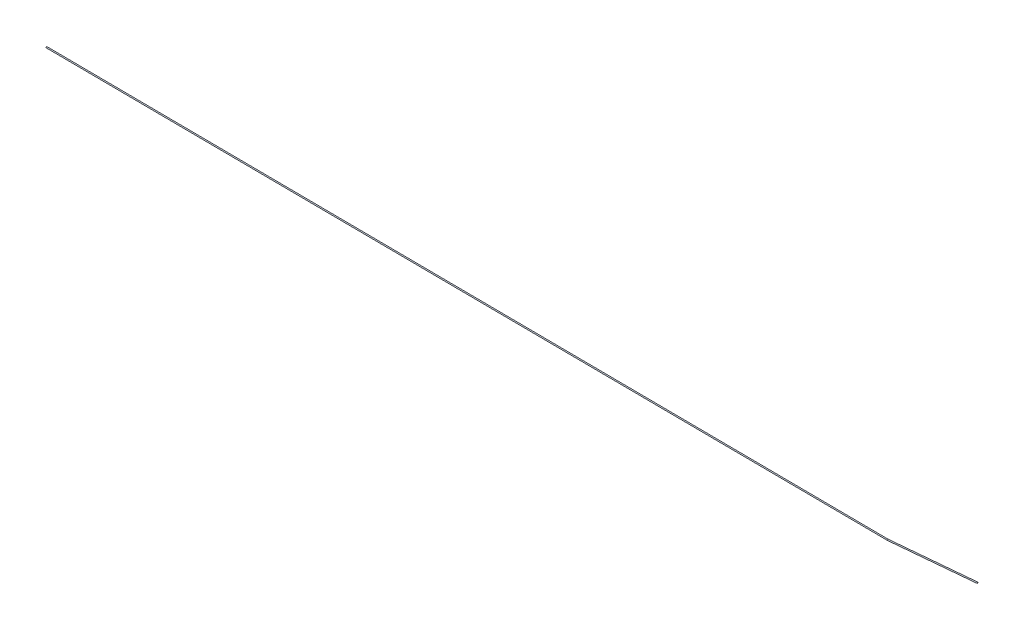
ISO-10303-21;
HEADER;
FILE_DESCRIPTION(('STEP AP214'),'2;1');
FILE_NAME('part.step','',(''),(''),'','','');
FILE_SCHEMA(('AUTOMOTIVE_DESIGN { 1 0 10303 214 1 1 1 1 }'));
ENDSEC;
DATA;
#1=APPLICATION_CONTEXT('core data for automotive mechanical design processes');
#2=APPLICATION_PROTOCOL_DEFINITION('international standard','automotive_design',2000,#1);
#3=PRODUCT_CONTEXT('',#1,'mechanical');
#4=PRODUCT('Part','Part','',(#3));
#5=PRODUCT_RELATED_PRODUCT_CATEGORY('part','',(#4));
#6=PRODUCT_DEFINITION_FORMATION('','',#4);
#7=PRODUCT_DEFINITION_CONTEXT('part definition',#1,'design');
#8=PRODUCT_DEFINITION('design','',#6,#7);
#9=PRODUCT_DEFINITION_SHAPE('','',#8);
#10=(LENGTH_UNIT() NAMED_UNIT(*) SI_UNIT(.MILLI.,.METRE.));
#11=(NAMED_UNIT(*) PLANE_ANGLE_UNIT() SI_UNIT($,.RADIAN.));
#12=(NAMED_UNIT(*) SI_UNIT($,.STERADIAN.) SOLID_ANGLE_UNIT());
#13=UNCERTAINTY_MEASURE_WITH_UNIT(LENGTH_MEASURE(1.E-05),#10,'distance_accuracy_value','');
#14=(GEOMETRIC_REPRESENTATION_CONTEXT(3) GLOBAL_UNCERTAINTY_ASSIGNED_CONTEXT((#13)) GLOBAL_UNIT_ASSIGNED_CONTEXT((#10,
#11,#12)) REPRESENTATION_CONTEXT('',''));
#15=CARTESIAN_POINT('',(0.,0.,0.));
#16=DIRECTION('',(0.,0.,1.));
#17=DIRECTION('',(1.,0.,0.));
#18=AXIS2_PLACEMENT_3D('',#15,#16,#17);
#19=CARTESIAN_POINT('',(128.983388504324,85.0229645542537,61.8008579252063));
#20=DIRECTION('',(-0.996475217263634,-0.00870239340051102,0.0834350629441612));
#21=DIRECTION('',(0.0834382224611486,0.,0.99651295176356));
#22=AXIS2_PLACEMENT_3D('',#19,#20,#21);
#23=PLANE('',#22);
#24=CARTESIAN_POINT('',(128.983388504324,85.0229645542537,61.8008579252063));
#25=DIRECTION('',(-0.996475217263634,-0.00870239340051102,0.0834350629441612));
#26=DIRECTION('',(0.0834382224611486,0.,0.99651295176356));
#27=AXIS2_PLACEMENT_3D('',#24,#25,#26);
#28=CIRCLE('',#27,0.410000000000002);
#29=CARTESIAN_POINT('',(129.017598175533,85.0229645542537,62.2094282354294));
#30=VERTEX_POINT('',#29);
#31=EDGE_CURVE('E39',#30,#30,#28,.T.);
#32=ORIENTED_EDGE('',*,*,#31,.F.);
#33=EDGE_LOOP('',(#32));
#34=FACE_BOUND('',#33,.T.);
#35=ADVANCED_FACE('F36',(#34),#23,.F.);
#36=CARTESIAN_POINT('',(-599.8749795883,90.0518455834173,68.1263249692301));
#37=DIRECTION('',(-0.99996356651658,0.00843739098217713,0.00129463232482552));
#38=DIRECTION('',(0.00129458640868742,-1.09035460448663E-05,0.99999916196322));
#39=AXIS2_PLACEMENT_3D('',#36,#37,#38);
#40=PLANE('',#39);
#41=CARTESIAN_POINT('',(-599.8749795883,90.0518455834173,68.1263249692301));
#42=DIRECTION('',(-0.99996356651658,0.00843739098217713,0.00129463232482552));
#43=DIRECTION('',(0.00129458640868742,-1.09035460448663E-05,0.99999916196322));
#44=AXIS2_PLACEMENT_3D('',#41,#42,#43);
#45=CIRCLE('',#44,0.410000000000002);
#46=CARTESIAN_POINT('',(-599.874448807873,90.0518411129634,68.536324625635));
#47=VERTEX_POINT('',#46);
#48=EDGE_CURVE('E43',#47,#47,#45,.T.);
#49=ORIENTED_EDGE('',*,*,#48,.T.);
#50=EDGE_LOOP('',(#49));
#51=FACE_BOUND('',#50,.T.);
#52=ADVANCED_FACE('F56',(#51),#40,.T.);
#53=CARTESIAN_POINT('',(63.4987717972968,84.4510758746424,67.2838975654982));
#54=DIRECTION('',(0.996475217263634,0.00870239340051124,-0.0834350629441609));
#55=DIRECTION('',(-0.0834382224611484,0.,-0.99651295176356));
#56=AXIS2_PLACEMENT_3D('',#53,#54,#55);
#57=CYLINDRICAL_SURFACE('',#56,0.410000000000002);
#58=CARTESIAN_POINT('',(63.6980668407495,84.4528163533225,67.2672105529094));
#59=DIRECTION('',(0.999100611482652,0.000132618180108127,-0.0424022469618094));
#60=DIRECTION('',(0.0415368244517337,-0.204088571247039,0.978070829388551));
#61=AXIS2_PLACEMENT_3D('',#58,#59,#60);
#62=ELLIPSE('',#61,0.410361944514283,0.410000000000002);
#63=CARTESIAN_POINT('',(63.7151119728005,84.3690661703724,67.66857360033));
#64=VERTEX_POINT('',#63);
#65=EDGE_CURVE('E11',#64,#64,#62,.T.);
#66=ORIENTED_EDGE('',*,*,#65,.T.);
#67=EDGE_LOOP('',(#66));
#68=FACE_BOUND('',#67,.T.);
#69=ORIENTED_EDGE('',*,*,#31,.T.);
#70=EDGE_LOOP('',(#69));
#71=FACE_BOUND('',#70,.T.);
#72=ADVANCED_FACE('F53',(#68,#71),#57,.T.);
#73=CARTESIAN_POINT('',(-599.8749795883,90.0518455834173,68.1263249692301));
#74=DIRECTION('',(0.999963566516579,-0.00843739098217691,-0.0012946323248253));
#75=DIRECTION('',(0.0084373980530268,0.999964404523528,0.));
#76=AXIS2_PLACEMENT_3D('',#73,#74,#75);
#77=CYLINDRICAL_SURFACE('',#76,0.410000000000002);
#78=ORIENTED_EDGE('',*,*,#48,.F.);
#79=EDGE_LOOP('',(#78));
#80=FACE_BOUND('',#79,.T.);
#81=ORIENTED_EDGE('',*,*,#65,.F.);
#82=EDGE_LOOP('',(#81));
#83=FACE_BOUND('',#82,.T.);
#84=ADVANCED_FACE('F60',(#80,#83),#77,.T.);
#85=CLOSED_SHELL('',(#35,#52,#72,#84));
#86=MANIFOLD_SOLID_BREP('B2',#85);
#87=ADVANCED_BREP_SHAPE_REPRESENTATION('',(#18,#86),#14);
#88=SHAPE_DEFINITION_REPRESENTATION(#9,#87);
ENDSEC;
END-ISO-10303-21;
